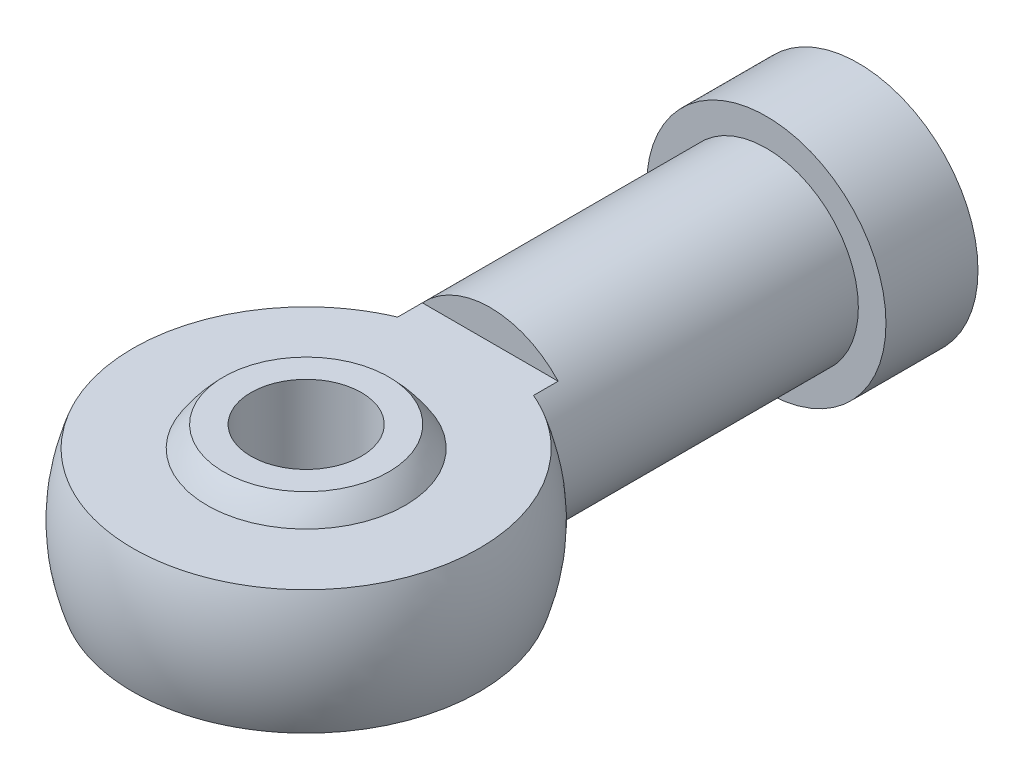
ISO-10303-21;
HEADER;
FILE_DESCRIPTION(('STEP AP214'),'2;1');
FILE_NAME('part.step','',(''),(''),'','','');
FILE_SCHEMA(('AUTOMOTIVE_DESIGN { 1 0 10303 214 1 1 1 1 }'));
ENDSEC;
DATA;
#1=APPLICATION_CONTEXT('core data for automotive mechanical design processes');
#2=APPLICATION_PROTOCOL_DEFINITION('international standard','automotive_design',2000,#1);
#3=PRODUCT_CONTEXT('',#1,'mechanical');
#4=PRODUCT('Part','Part','',(#3));
#5=PRODUCT_RELATED_PRODUCT_CATEGORY('part','',(#4));
#6=PRODUCT_DEFINITION_FORMATION('','',#4);
#7=PRODUCT_DEFINITION_CONTEXT('part definition',#1,'design');
#8=PRODUCT_DEFINITION('design','',#6,#7);
#9=PRODUCT_DEFINITION_SHAPE('','',#8);
#10=(LENGTH_UNIT() NAMED_UNIT(*) SI_UNIT(.MILLI.,.METRE.));
#11=(NAMED_UNIT(*) PLANE_ANGLE_UNIT() SI_UNIT($,.RADIAN.));
#12=(NAMED_UNIT(*) SI_UNIT($,.STERADIAN.) SOLID_ANGLE_UNIT());
#13=UNCERTAINTY_MEASURE_WITH_UNIT(LENGTH_MEASURE(1.E-05),#10,'distance_accuracy_value','');
#14=(GEOMETRIC_REPRESENTATION_CONTEXT(3) GLOBAL_UNCERTAINTY_ASSIGNED_CONTEXT((#13)) GLOBAL_UNIT_ASSIGNED_CONTEXT((#10,
#11,#12)) REPRESENTATION_CONTEXT('',''));
#15=CARTESIAN_POINT('',(0.,0.,0.));
#16=DIRECTION('',(0.,0.,1.));
#17=DIRECTION('',(1.,0.,0.));
#18=AXIS2_PLACEMENT_3D('',#15,#16,#17);
#19=CARTESIAN_POINT('',(0.,0.,5.));
#20=DIRECTION('',(0.,0.,-1.));
#21=DIRECTION('',(-1.,0.,0.));
#22=AXIS2_PLACEMENT_3D('',#19,#20,#21);
#23=CYLINDRICAL_SURFACE('',#22,6.5);
#24=CARTESIAN_POINT('',(0.,0.,5.));
#25=DIRECTION('',(0.,0.,1.));
#26=DIRECTION('',(1.,0.,0.));
#27=AXIS2_PLACEMENT_3D('',#24,#25,#26);
#28=CIRCLE('',#27,6.5);
#29=CARTESIAN_POINT('',(6.5,0.,5.));
#30=VERTEX_POINT('',#29);
#31=EDGE_CURVE('E138',#30,#30,#28,.T.);
#32=ORIENTED_EDGE('',*,*,#31,.F.);
#33=EDGE_LOOP('',(#32));
#34=FACE_BOUND('',#33,.T.);
#35=CARTESIAN_POINT('',(0.,0.,0.));
#36=DIRECTION('',(0.,0.,1.));
#37=DIRECTION('',(1.,0.,0.));
#38=AXIS2_PLACEMENT_3D('',#35,#36,#37);
#39=CIRCLE('',#38,6.5);
#40=CARTESIAN_POINT('',(6.5,0.,0.));
#41=VERTEX_POINT('',#40);
#42=EDGE_CURVE('E142',#41,#41,#39,.T.);
#43=ORIENTED_EDGE('',*,*,#42,.T.);
#44=EDGE_LOOP('',(#43));
#45=FACE_BOUND('',#44,.T.);
#46=ADVANCED_FACE('F42',(#34,#45),#23,.T.);
#47=CARTESIAN_POINT('',(0.,0.,5.));
#48=DIRECTION('',(0.,0.,1.));
#49=DIRECTION('',(1.,0.,0.));
#50=AXIS2_PLACEMENT_3D('',#47,#48,#49);
#51=PLANE('',#50);
#52=CARTESIAN_POINT('',(0.,0.,5.));
#53=DIRECTION('',(0.,0.,1.));
#54=DIRECTION('',(1.,0.,0.));
#55=AXIS2_PLACEMENT_3D('',#52,#53,#54);
#56=CIRCLE('',#55,5.);
#57=CARTESIAN_POINT('',(5.,0.,5.));
#58=VERTEX_POINT('',#57);
#59=EDGE_CURVE('E133',#58,#58,#56,.T.);
#60=ORIENTED_EDGE('',*,*,#59,.F.);
#61=EDGE_LOOP('',(#60));
#62=FACE_BOUND('',#61,.T.);
#63=ORIENTED_EDGE('',*,*,#31,.T.);
#64=EDGE_LOOP('',(#63));
#65=FACE_BOUND('',#64,.T.);
#66=ADVANCED_FACE('F182',(#62,#65),#51,.T.);
#67=CARTESIAN_POINT('',(0.,0.,0.));
#68=DIRECTION('',(0.,0.,1.));
#69=DIRECTION('',(1.,0.,0.));
#70=AXIS2_PLACEMENT_3D('',#67,#68,#69);
#71=PLANE('',#70);
#72=CARTESIAN_POINT('',(0.,0.,0.));
#73=DIRECTION('',(0.,0.,-1.));
#74=DIRECTION('',(-1.,0.,0.));
#75=AXIS2_PLACEMENT_3D('',#72,#73,#74);
#76=CIRCLE('',#75,3.025);
#77=CARTESIAN_POINT('',(-3.025,0.,0.));
#78=VERTEX_POINT('',#77);
#79=EDGE_CURVE('E107',#78,#78,#76,.T.);
#80=ORIENTED_EDGE('',*,*,#79,.F.);
#81=EDGE_LOOP('',(#80));
#82=FACE_BOUND('',#81,.T.);
#83=ORIENTED_EDGE('',*,*,#42,.F.);
#84=EDGE_LOOP('',(#83));
#85=FACE_BOUND('',#84,.T.);
#86=ADVANCED_FACE('F178',(#82,#85),#71,.F.);
#87=CARTESIAN_POINT('',(0.,0.,25.));
#88=DIRECTION('',(0.,0.,-1.));
#89=DIRECTION('',(-1.,0.,0.));
#90=AXIS2_PLACEMENT_3D('',#87,#88,#89);
#91=CYLINDRICAL_SURFACE('',#90,5.);
#92=CARTESIAN_POINT('',(0.,0.,21.3397459621556));
#93=DIRECTION('',(0.,0.,1.));
#94=DIRECTION('',(1.,0.,0.));
#95=AXIS2_PLACEMENT_3D('',#92,#93,#94);
#96=CIRCLE('',#95,5.);
#97=CARTESIAN_POINT('',(3.68908864084343,3.375,21.3397459621556));
#98=VERTEX_POINT('',#97);
#99=CARTESIAN_POINT('',(3.68908864084343,-3.375,21.3397459621556));
#100=VERTEX_POINT('',#99);
#101=EDGE_CURVE('E132',#98,#100,#96,.F.);
#102=ORIENTED_EDGE('',*,*,#101,.T.);
#103=DIRECTION('',(0.,0.,-1.));
#104=VECTOR('',#103,1.);
#105=CARTESIAN_POINT('',(3.68908864084343,-3.375,25.));
#106=LINE('',#105,#104);
#107=CARTESIAN_POINT('',(3.68908864084343,-3.375,20.));
#108=VERTEX_POINT('',#107);
#109=EDGE_CURVE('E67',#100,#108,#106,.T.);
#110=ORIENTED_EDGE('',*,*,#109,.T.);
#111=CARTESIAN_POINT('',(0.,0.,20.));
#112=DIRECTION('',(0.,0.,-1.));
#113=DIRECTION('',(-1.,0.,0.));
#114=AXIS2_PLACEMENT_3D('',#111,#112,#113);
#115=CIRCLE('',#114,5.);
#116=CARTESIAN_POINT('',(-3.68908864084343,-3.375,20.));
#117=VERTEX_POINT('',#116);
#118=EDGE_CURVE('E11',#108,#117,#115,.T.);
#119=ORIENTED_EDGE('',*,*,#118,.T.);
#120=DIRECTION('',(0.,0.,-1.));
#121=VECTOR('',#120,1.);
#122=CARTESIAN_POINT('',(-3.68908864084343,-3.375,25.));
#123=LINE('',#122,#121);
#124=CARTESIAN_POINT('',(-3.68908864084343,-3.375,21.3397459621556));
#125=VERTEX_POINT('',#124);
#126=EDGE_CURVE('E126',#117,#125,#123,.F.);
#127=ORIENTED_EDGE('',*,*,#126,.T.);
#128=CARTESIAN_POINT('',(-3.68908864084342,3.375,21.3397459621556));
#129=VERTEX_POINT('',#128);
#130=EDGE_CURVE('E146',#125,#129,#96,.F.);
#131=ORIENTED_EDGE('',*,*,#130,.T.);
#132=DIRECTION('',(0.,0.,-1.));
#133=VECTOR('',#132,1.);
#134=CARTESIAN_POINT('',(-3.68908864084343,3.375,25.));
#135=LINE('',#134,#133);
#136=CARTESIAN_POINT('',(-3.68908864084343,3.375,20.));
#137=VERTEX_POINT('',#136);
#138=EDGE_CURVE('E59',#129,#137,#135,.T.);
#139=ORIENTED_EDGE('',*,*,#138,.T.);
#140=CARTESIAN_POINT('',(3.68908864084342,3.375,20.));
#141=VERTEX_POINT('',#140);
#142=EDGE_CURVE('E51',#137,#141,#115,.T.);
#143=ORIENTED_EDGE('',*,*,#142,.T.);
#144=DIRECTION('',(0.,0.,-1.));
#145=VECTOR('',#144,1.);
#146=CARTESIAN_POINT('',(3.68908864084342,3.375,25.));
#147=LINE('',#146,#145);
#148=EDGE_CURVE('E120',#141,#98,#147,.F.);
#149=ORIENTED_EDGE('',*,*,#148,.T.);
#150=EDGE_LOOP('',(#102,#110,#119,#127,#131,#139,#143,#149));
#151=FACE_BOUND('',#150,.T.);
#152=ORIENTED_EDGE('',*,*,#59,.T.);
#153=EDGE_LOOP('',(#152));
#154=FACE_BOUND('',#153,.T.);
#155=ADVANCED_FACE('F181',(#151,#154),#91,.T.);
#156=CARTESIAN_POINT('',(0.,0.,30.));
#157=DIRECTION('',(0.,0.,-1.));
#158=DIRECTION('',(1.,0.,0.));
#159=AXIS2_PLACEMENT_3D('',#156,#157,#158);
#160=SPHERICAL_SURFACE('',#159,10.);
#161=CARTESIAN_POINT('',(0.,-3.375,30.));
#162=DIRECTION('',(0.,1.,0.));
#163=DIRECTION('',(-1.,0.,0.));
#164=AXIS2_PLACEMENT_3D('',#161,#162,#163);
#165=CIRCLE('',#164,9.41325528178218);
#166=EDGE_CURVE('E152',#100,#125,#165,.F.);
#167=ORIENTED_EDGE('',*,*,#166,.F.);
#168=ORIENTED_EDGE('',*,*,#101,.F.);
#169=CARTESIAN_POINT('',(0.,3.375,30.));
#170=DIRECTION('',(0.,-1.,0.));
#171=DIRECTION('',(1.,0.,0.));
#172=AXIS2_PLACEMENT_3D('',#169,#170,#171);
#173=CIRCLE('',#172,9.41325528178218);
#174=EDGE_CURVE('E137',#129,#98,#173,.F.);
#175=ORIENTED_EDGE('',*,*,#174,.F.);
#176=ORIENTED_EDGE('',*,*,#130,.F.);
#177=EDGE_LOOP('',(#167,#168,#175,#176));
#178=FACE_BOUND('',#177,.T.);
#179=ADVANCED_FACE('F200',(#178),#160,.T.);
#180=CARTESIAN_POINT('',(12.,3.375,45.));
#181=DIRECTION('',(0.,-1.,0.));
#182=DIRECTION('',(1.,0.,0.));
#183=AXIS2_PLACEMENT_3D('',#180,#181,#182);
#184=PLANE('',#183);
#185=CARTESIAN_POINT('',(0.,3.375,30.));
#186=DIRECTION('',(0.,-1.,0.));
#187=DIRECTION('',(1.,0.,0.));
#188=AXIS2_PLACEMENT_3D('',#185,#186,#187);
#189=CIRCLE('',#188,5.37883584058855);
#190=CARTESIAN_POINT('',(5.37883584058856,3.375,30.));
#191=VERTEX_POINT('',#190);
#192=EDGE_CURVE('E104',#191,#191,#189,.T.);
#193=ORIENTED_EDGE('',*,*,#192,.T.);
#194=EDGE_LOOP('',(#193));
#195=FACE_BOUND('',#194,.T.);
#196=ORIENTED_EDGE('',*,*,#174,.T.);
#197=ORIENTED_EDGE('',*,*,#148,.F.);
#198=DIRECTION('',(-1.,0.,0.));
#199=VECTOR('',#198,1.);
#200=CARTESIAN_POINT('',(12.,3.375,20.));
#201=LINE('',#200,#199);
#202=EDGE_CURVE('E117',#141,#137,#201,.T.);
#203=ORIENTED_EDGE('',*,*,#202,.T.);
#204=ORIENTED_EDGE('',*,*,#138,.F.);
#205=EDGE_LOOP('',(#196,#197,#203,#204));
#206=FACE_BOUND('',#205,.T.);
#207=ADVANCED_FACE('F204',(#195,#206),#184,.F.);
#208=CARTESIAN_POINT('',(0.,0.,20.));
#209=DIRECTION('',(0.,0.,-1.));
#210=DIRECTION('',(-1.,0.,0.));
#211=AXIS2_PLACEMENT_3D('',#208,#209,#210);
#212=PLANE('',#211);
#213=ORIENTED_EDGE('',*,*,#202,.F.);
#214=ORIENTED_EDGE('',*,*,#142,.F.);
#215=EDGE_LOOP('',(#213,#214));
#216=FACE_BOUND('',#215,.T.);
#217=ADVANCED_FACE('F206',(#216),#212,.F.);
#218=DIRECTION('',(1.,0.,0.));
#219=VECTOR('',#218,1.);
#220=CARTESIAN_POINT('',(12.,-3.375,20.));
#221=LINE('',#220,#219);
#222=EDGE_CURVE('E114',#117,#108,#221,.T.);
#223=ORIENTED_EDGE('',*,*,#222,.F.);
#224=ORIENTED_EDGE('',*,*,#118,.F.);
#225=EDGE_LOOP('',(#223,#224));
#226=FACE_BOUND('',#225,.T.);
#227=ADVANCED_FACE('F209',(#226),#212,.F.);
#228=CARTESIAN_POINT('',(12.,-3.375,45.));
#229=DIRECTION('',(0.,1.,0.));
#230=DIRECTION('',(-1.,0.,0.));
#231=AXIS2_PLACEMENT_3D('',#228,#229,#230);
#232=PLANE('',#231);
#233=CARTESIAN_POINT('',(0.,-3.375,30.));
#234=DIRECTION('',(0.,1.,0.));
#235=DIRECTION('',(-1.,0.,0.));
#236=AXIS2_PLACEMENT_3D('',#233,#234,#235);
#237=CIRCLE('',#236,5.37883584058856);
#238=CARTESIAN_POINT('',(-5.37883584058855,-3.375,30.));
#239=VERTEX_POINT('',#238);
#240=EDGE_CURVE('E98',#239,#239,#237,.T.);
#241=ORIENTED_EDGE('',*,*,#240,.T.);
#242=EDGE_LOOP('',(#241));
#243=FACE_BOUND('',#242,.T.);
#244=ORIENTED_EDGE('',*,*,#166,.T.);
#245=ORIENTED_EDGE('',*,*,#126,.F.);
#246=ORIENTED_EDGE('',*,*,#222,.T.);
#247=ORIENTED_EDGE('',*,*,#109,.F.);
#248=EDGE_LOOP('',(#244,#245,#246,#247));
#249=FACE_BOUND('',#248,.T.);
#250=ADVANCED_FACE('F211',(#243,#249),#232,.F.);
#251=CARTESIAN_POINT('',(0.,0.,30.));
#252=DIRECTION('',(-1.,0.,0.));
#253=DIRECTION('',(0.,0.,-1.));
#254=AXIS2_PLACEMENT_3D('',#251,#252,#253);
#255=SPHERICAL_SURFACE('',#254,6.35);
#256=CARTESIAN_POINT('',(0.,0.,30.));
#257=DIRECTION('',(0.,1.,0.));
#258=DIRECTION('',(-1.,0.,0.));
#259=AXIS2_PLACEMENT_3D('',#256,#257,#258);
#260=SPHERICAL_SURFACE('',#259,6.35);
#261=CARTESIAN_POINT('',(0.,-4.5,30.));
#262=DIRECTION('',(0.,1.,0.));
#263=DIRECTION('',(-1.,0.,0.));
#264=AXIS2_PLACEMENT_3D('',#261,#262,#263);
#265=CIRCLE('',#264,4.48023436886956);
#266=CARTESIAN_POINT('',(-4.48023436886955,-4.5,30.));
#267=VERTEX_POINT('',#266);
#268=EDGE_CURVE('E168',#267,#267,#265,.F.);
#269=ORIENTED_EDGE('',*,*,#268,.F.);
#270=EDGE_LOOP('',(#269));
#271=FACE_BOUND('',#270,.T.);
#272=ORIENTED_EDGE('',*,*,#240,.F.);
#273=EDGE_LOOP('',(#272));
#274=FACE_BOUND('',#273,.T.);
#275=ADVANCED_FACE('F214',(#271,#274),#260,.T.);
#276=CARTESIAN_POINT('',(0.,0.,30.));
#277=DIRECTION('',(0.,-1.,0.));
#278=DIRECTION('',(1.,0.,0.));
#279=AXIS2_PLACEMENT_3D('',#276,#277,#278);
#280=SPHERICAL_SURFACE('',#279,6.35);
#281=CARTESIAN_POINT('',(0.,4.5,30.));
#282=DIRECTION('',(0.,-1.,0.));
#283=DIRECTION('',(1.,0.,0.));
#284=AXIS2_PLACEMENT_3D('',#281,#282,#283);
#285=CIRCLE('',#284,4.48023436886956);
#286=CARTESIAN_POINT('',(4.48023436886956,4.5,30.));
#287=VERTEX_POINT('',#286);
#288=EDGE_CURVE('E158',#287,#287,#285,.F.);
#289=ORIENTED_EDGE('',*,*,#288,.F.);
#290=EDGE_LOOP('',(#289));
#291=FACE_BOUND('',#290,.T.);
#292=ORIENTED_EDGE('',*,*,#192,.F.);
#293=EDGE_LOOP('',(#292));
#294=FACE_BOUND('',#293,.T.);
#295=ADVANCED_FACE('F91',(#291,#294),#280,.T.);
#296=CARTESIAN_POINT('',(0.,0.,15.));
#297=DIRECTION('',(0.,0.,-1.));
#298=DIRECTION('',(-1.,0.,0.));
#299=AXIS2_PLACEMENT_3D('',#296,#297,#298);
#300=CONICAL_SURFACE('',#299,2.49999999999999,1.02974425867665);
#301=CARTESIAN_POINT('',(0.,0.,16.5021515475689));
#302=VERTEX_POINT('',#301);
#303=VERTEX_LOOP('',#302);
#304=FACE_BOUND('',#303,.T.);
#305=CARTESIAN_POINT('',(0.,0.,15.));
#306=DIRECTION('',(0.,0.,-1.));
#307=DIRECTION('',(-1.,0.,0.));
#308=AXIS2_PLACEMENT_3D('',#305,#306,#307);
#309=CIRCLE('',#308,2.49999999999999);
#310=CARTESIAN_POINT('',(-2.49999999999999,0.,15.));
#311=VERTEX_POINT('',#310);
#312=EDGE_CURVE('E95',#311,#311,#309,.T.);
#313=ORIENTED_EDGE('',*,*,#312,.T.);
#314=EDGE_LOOP('',(#313));
#315=FACE_BOUND('',#314,.T.);
#316=ADVANCED_FACE('F87',(#304,#315),#300,.F.);
#317=CARTESIAN_POINT('',(0.,0.,0.));
#318=DIRECTION('',(0.,0.,-1.));
#319=DIRECTION('',(-1.,0.,0.));
#320=AXIS2_PLACEMENT_3D('',#317,#318,#319);
#321=CYLINDRICAL_SURFACE('',#320,2.49999999999999);
#322=ORIENTED_EDGE('',*,*,#312,.F.);
#323=EDGE_LOOP('',(#322));
#324=FACE_BOUND('',#323,.T.);
#325=CARTESIAN_POINT('',(0.,0.,0.525000000000003));
#326=DIRECTION('',(0.,0.,-1.));
#327=DIRECTION('',(-1.,0.,0.));
#328=AXIS2_PLACEMENT_3D('',#325,#326,#327);
#329=CIRCLE('',#328,2.5);
#330=CARTESIAN_POINT('',(-2.5,0.,0.525000000000003));
#331=VERTEX_POINT('',#330);
#332=EDGE_CURVE('E99',#331,#331,#329,.T.);
#333=ORIENTED_EDGE('',*,*,#332,.T.);
#334=EDGE_LOOP('',(#333));
#335=FACE_BOUND('',#334,.T.);
#336=ADVANCED_FACE('F90',(#324,#335),#321,.F.);
#337=CARTESIAN_POINT('',(0.,0.,0.));
#338=DIRECTION('',(0.,0.,-1.));
#339=DIRECTION('',(-1.,0.,0.));
#340=AXIS2_PLACEMENT_3D('',#337,#338,#339);
#341=CONICAL_SURFACE('',#340,3.025,0.785398163397445);
#342=ORIENTED_EDGE('',*,*,#332,.F.);
#343=EDGE_LOOP('',(#342));
#344=FACE_BOUND('',#343,.T.);
#345=ORIENTED_EDGE('',*,*,#79,.T.);
#346=EDGE_LOOP('',(#345));
#347=FACE_BOUND('',#346,.T.);
#348=ADVANCED_FACE('F176',(#344,#347),#341,.F.);
#349=CARTESIAN_POINT('',(12.5,4.5,40.));
#350=DIRECTION('',(0.,-1.,0.));
#351=DIRECTION('',(1.,0.,0.));
#352=AXIS2_PLACEMENT_3D('',#349,#350,#351);
#353=PLANE('',#352);
#354=ORIENTED_EDGE('',*,*,#288,.T.);
#355=EDGE_LOOP('',(#354));
#356=FACE_BOUND('',#355,.T.);
#357=CARTESIAN_POINT('',(0.,4.5,30.));
#358=DIRECTION('',(0.,-1.,0.));
#359=DIRECTION('',(1.,0.,0.));
#360=AXIS2_PLACEMENT_3D('',#357,#358,#359);
#361=CIRCLE('',#360,3.);
#362=CARTESIAN_POINT('',(3.,4.5,30.));
#363=VERTEX_POINT('',#362);
#364=EDGE_CURVE('E155',#363,#363,#361,.F.);
#365=ORIENTED_EDGE('',*,*,#364,.F.);
#366=EDGE_LOOP('',(#365));
#367=FACE_BOUND('',#366,.T.);
#368=ADVANCED_FACE('F231',(#356,#367),#353,.F.);
#369=CARTESIAN_POINT('',(12.5,-4.5,40.));
#370=DIRECTION('',(0.,1.,0.));
#371=DIRECTION('',(-1.,0.,0.));
#372=AXIS2_PLACEMENT_3D('',#369,#370,#371);
#373=PLANE('',#372);
#374=ORIENTED_EDGE('',*,*,#268,.T.);
#375=EDGE_LOOP('',(#374));
#376=FACE_BOUND('',#375,.T.);
#377=CARTESIAN_POINT('',(0.,-4.5,30.));
#378=DIRECTION('',(0.,1.,0.));
#379=DIRECTION('',(-1.,0.,0.));
#380=AXIS2_PLACEMENT_3D('',#377,#378,#379);
#381=CIRCLE('',#380,3.);
#382=CARTESIAN_POINT('',(-3.,-4.5,30.));
#383=VERTEX_POINT('',#382);
#384=EDGE_CURVE('E45',#383,#383,#381,.F.);
#385=ORIENTED_EDGE('',*,*,#384,.F.);
#386=EDGE_LOOP('',(#385));
#387=FACE_BOUND('',#386,.T.);
#388=ADVANCED_FACE('F224',(#376,#387),#373,.F.);
#389=CARTESIAN_POINT('',(0.,-6.5,30.));
#390=DIRECTION('',(0.,1.,0.));
#391=DIRECTION('',(-1.,0.,0.));
#392=AXIS2_PLACEMENT_3D('',#389,#390,#391);
#393=CYLINDRICAL_SURFACE('',#392,3.);
#394=ORIENTED_EDGE('',*,*,#384,.T.);
#395=EDGE_LOOP('',(#394));
#396=FACE_BOUND('',#395,.T.);
#397=ORIENTED_EDGE('',*,*,#364,.T.);
#398=EDGE_LOOP('',(#397));
#399=FACE_BOUND('',#398,.T.);
#400=ADVANCED_FACE('F222',(#396,#399),#393,.F.);
#401=CLOSED_SHELL('',(#46,#66,#86,#155,#179,#207,#217,#227,#250,#275,#295,#316,#336,#348,#368,
#388,#400));
#402=MANIFOLD_SOLID_BREP('B2',#401);
#403=ADVANCED_BREP_SHAPE_REPRESENTATION('',(#18,#402),#14);
#404=SHAPE_DEFINITION_REPRESENTATION(#9,#403);
ENDSEC;
END-ISO-10303-21;
